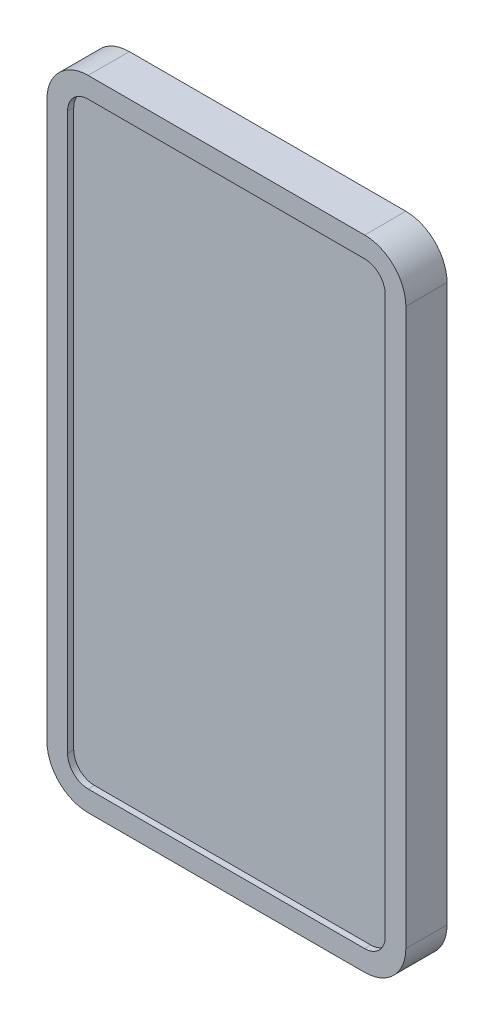
ISO-10303-21;
HEADER;
FILE_DESCRIPTION(('STEP AP214'),'2;1');
FILE_NAME('part.step','',(''),(''),'','','');
FILE_SCHEMA(('AUTOMOTIVE_DESIGN { 1 0 10303 214 1 1 1 1 }'));
ENDSEC;
DATA;
#1=APPLICATION_CONTEXT('core data for automotive mechanical design processes');
#2=APPLICATION_PROTOCOL_DEFINITION('international standard','automotive_design',2000,#1);
#3=PRODUCT_CONTEXT('',#1,'mechanical');
#4=PRODUCT('Part','Part','',(#3));
#5=PRODUCT_RELATED_PRODUCT_CATEGORY('part','',(#4));
#6=PRODUCT_DEFINITION_FORMATION('','',#4);
#7=PRODUCT_DEFINITION_CONTEXT('part definition',#1,'design');
#8=PRODUCT_DEFINITION('design','',#6,#7);
#9=PRODUCT_DEFINITION_SHAPE('','',#8);
#10=(LENGTH_UNIT() NAMED_UNIT(*) SI_UNIT(.MILLI.,.METRE.));
#11=(NAMED_UNIT(*) PLANE_ANGLE_UNIT() SI_UNIT($,.RADIAN.));
#12=(NAMED_UNIT(*) SI_UNIT($,.STERADIAN.) SOLID_ANGLE_UNIT());
#13=UNCERTAINTY_MEASURE_WITH_UNIT(LENGTH_MEASURE(1.E-05),#10,'distance_accuracy_value','');
#14=(GEOMETRIC_REPRESENTATION_CONTEXT(3) GLOBAL_UNCERTAINTY_ASSIGNED_CONTEXT((#13)) GLOBAL_UNIT_ASSIGNED_CONTEXT((#10,
#11,#12)) REPRESENTATION_CONTEXT('',''));
#15=CARTESIAN_POINT('',(0.,0.,0.));
#16=DIRECTION('',(0.,0.,1.));
#17=DIRECTION('',(1.,0.,0.));
#18=AXIS2_PLACEMENT_3D('',#15,#16,#17);
#19=CARTESIAN_POINT('',(0.,155.,20.));
#20=DIRECTION('',(0.,1.,0.));
#21=DIRECTION('',(0.,0.,1.));
#22=AXIS2_PLACEMENT_3D('',#19,#20,#21);
#23=PLANE('',#22);
#24=DIRECTION('',(1.,0.,0.));
#25=VECTOR('',#24,1.);
#26=CARTESIAN_POINT('',(0.,155.,0.));
#27=LINE('',#26,#25);
#28=CARTESIAN_POINT('',(-67.1082085684236,155.,0.));
#29=VERTEX_POINT('',#28);
#30=CARTESIAN_POINT('',(67.1082085684237,155.,0.));
#31=VERTEX_POINT('',#30);
#32=EDGE_CURVE('E139',#29,#31,#27,.T.);
#33=ORIENTED_EDGE('',*,*,#32,.F.);
#34=DIRECTION('',(0.,0.,-1.));
#35=VECTOR('',#34,1.);
#36=CARTESIAN_POINT('',(-67.1082085684236,155.,20.));
#37=LINE('',#36,#35);
#38=CARTESIAN_POINT('',(-67.1082085684236,155.,20.));
#39=VERTEX_POINT('',#38);
#40=EDGE_CURVE('E11',#39,#29,#37,.T.);
#41=ORIENTED_EDGE('',*,*,#40,.F.);
#42=DIRECTION('',(1.,0.,0.));
#43=VECTOR('',#42,1.);
#44=CARTESIAN_POINT('',(0.,155.,20.));
#45=LINE('',#44,#43);
#46=CARTESIAN_POINT('',(67.1082085684237,155.,20.));
#47=VERTEX_POINT('',#46);
#48=EDGE_CURVE('E158',#39,#47,#45,.T.);
#49=ORIENTED_EDGE('',*,*,#48,.T.);
#50=DIRECTION('',(0.,0.,-1.));
#51=VECTOR('',#50,1.);
#52=CARTESIAN_POINT('',(67.1082085684237,155.,20.));
#53=LINE('',#52,#51);
#54=EDGE_CURVE('E89',#47,#31,#53,.T.);
#55=ORIENTED_EDGE('',*,*,#54,.T.);
#56=EDGE_LOOP('',(#33,#41,#49,#55));
#57=FACE_BOUND('',#56,.T.);
#58=ADVANCED_FACE('F34',(#57),#23,.T.);
#59=CARTESIAN_POINT('',(-67.1082085684237,135.,20.));
#60=DIRECTION('',(0.,0.,-1.));
#61=DIRECTION('',(-1.,0.,0.));
#62=AXIS2_PLACEMENT_3D('',#59,#60,#61);
#63=CYLINDRICAL_SURFACE('',#62,20.);
#64=CARTESIAN_POINT('',(-67.1082085684237,135.,0.));
#65=DIRECTION('',(0.,0.,1.));
#66=DIRECTION('',(1.,0.,0.));
#67=AXIS2_PLACEMENT_3D('',#64,#65,#66);
#68=CIRCLE('',#67,20.);
#69=CARTESIAN_POINT('',(-87.1082085684237,135.,0.));
#70=VERTEX_POINT('',#69);
#71=EDGE_CURVE('E142',#29,#70,#68,.T.);
#72=ORIENTED_EDGE('',*,*,#71,.T.);
#73=DIRECTION('',(0.,0.,-1.));
#74=VECTOR('',#73,1.);
#75=CARTESIAN_POINT('',(-87.1082085684237,135.,20.));
#76=LINE('',#75,#74);
#77=CARTESIAN_POINT('',(-87.1082085684237,135.,20.));
#78=VERTEX_POINT('',#77);
#79=EDGE_CURVE('E41',#78,#70,#76,.T.);
#80=ORIENTED_EDGE('',*,*,#79,.F.);
#81=CARTESIAN_POINT('',(-67.1082085684237,135.,20.));
#82=DIRECTION('',(0.,0.,1.));
#83=DIRECTION('',(1.,0.,0.));
#84=AXIS2_PLACEMENT_3D('',#81,#82,#83);
#85=CIRCLE('',#84,20.);
#86=EDGE_CURVE('E190',#39,#78,#85,.T.);
#87=ORIENTED_EDGE('',*,*,#86,.F.);
#88=ORIENTED_EDGE('',*,*,#40,.T.);
#89=EDGE_LOOP('',(#72,#80,#87,#88));
#90=FACE_BOUND('',#89,.T.);
#91=ADVANCED_FACE('F175',(#90),#63,.T.);
#92=CARTESIAN_POINT('',(-87.1082085684237,0.,20.));
#93=DIRECTION('',(-1.,0.,0.));
#94=DIRECTION('',(0.,0.,1.));
#95=AXIS2_PLACEMENT_3D('',#92,#93,#94);
#96=PLANE('',#95);
#97=DIRECTION('',(0.,1.,0.));
#98=VECTOR('',#97,1.);
#99=CARTESIAN_POINT('',(-87.1082085684237,0.,0.));
#100=LINE('',#99,#98);
#101=CARTESIAN_POINT('',(-87.1082085684237,-135.,0.));
#102=VERTEX_POINT('',#101);
#103=EDGE_CURVE('E146',#102,#70,#100,.T.);
#104=ORIENTED_EDGE('',*,*,#103,.F.);
#105=DIRECTION('',(0.,0.,-1.));
#106=VECTOR('',#105,1.);
#107=CARTESIAN_POINT('',(-87.1082085684237,-135.,20.));
#108=LINE('',#107,#106);
#109=CARTESIAN_POINT('',(-87.1082085684237,-135.,20.));
#110=VERTEX_POINT('',#109);
#111=EDGE_CURVE('E165',#110,#102,#108,.T.);
#112=ORIENTED_EDGE('',*,*,#111,.F.);
#113=DIRECTION('',(0.,1.,0.));
#114=VECTOR('',#113,1.);
#115=CARTESIAN_POINT('',(-87.1082085684237,0.,20.));
#116=LINE('',#115,#114);
#117=EDGE_CURVE('E172',#110,#78,#116,.T.);
#118=ORIENTED_EDGE('',*,*,#117,.T.);
#119=ORIENTED_EDGE('',*,*,#79,.T.);
#120=EDGE_LOOP('',(#104,#112,#118,#119));
#121=FACE_BOUND('',#120,.T.);
#122=ADVANCED_FACE('F170',(#121),#96,.T.);
#123=CARTESIAN_POINT('',(-67.1082085684237,-135.,20.));
#124=DIRECTION('',(0.,0.,-1.));
#125=DIRECTION('',(-1.,0.,0.));
#126=AXIS2_PLACEMENT_3D('',#123,#124,#125);
#127=CYLINDRICAL_SURFACE('',#126,20.);
#128=CARTESIAN_POINT('',(-67.1082085684237,-135.,0.));
#129=DIRECTION('',(0.,0.,1.));
#130=DIRECTION('',(1.,0.,0.));
#131=AXIS2_PLACEMENT_3D('',#128,#129,#130);
#132=CIRCLE('',#131,20.);
#133=CARTESIAN_POINT('',(-67.1082085684236,-155.,0.));
#134=VERTEX_POINT('',#133);
#135=EDGE_CURVE('E149',#102,#134,#132,.T.);
#136=ORIENTED_EDGE('',*,*,#135,.T.);
#137=DIRECTION('',(0.,0.,-1.));
#138=VECTOR('',#137,1.);
#139=CARTESIAN_POINT('',(-67.1082085684236,-155.,20.));
#140=LINE('',#139,#138);
#141=CARTESIAN_POINT('',(-67.1082085684236,-155.,20.));
#142=VERTEX_POINT('',#141);
#143=EDGE_CURVE('E162',#142,#134,#140,.T.);
#144=ORIENTED_EDGE('',*,*,#143,.F.);
#145=CARTESIAN_POINT('',(-67.1082085684237,-135.,20.));
#146=DIRECTION('',(0.,0.,1.));
#147=DIRECTION('',(1.,0.,0.));
#148=AXIS2_PLACEMENT_3D('',#145,#146,#147);
#149=CIRCLE('',#148,20.);
#150=EDGE_CURVE('E186',#110,#142,#149,.T.);
#151=ORIENTED_EDGE('',*,*,#150,.F.);
#152=ORIENTED_EDGE('',*,*,#111,.T.);
#153=EDGE_LOOP('',(#136,#144,#151,#152));
#154=FACE_BOUND('',#153,.T.);
#155=ADVANCED_FACE('F182',(#154),#127,.T.);
#156=CARTESIAN_POINT('',(0.,-155.,20.));
#157=DIRECTION('',(0.,1.,0.));
#158=DIRECTION('',(-1.,0.,0.));
#159=AXIS2_PLACEMENT_3D('',#156,#157,#158);
#160=PLANE('',#159);
#161=DIRECTION('',(1.,0.,0.));
#162=VECTOR('',#161,1.);
#163=CARTESIAN_POINT('',(0.,-155.,0.));
#164=LINE('',#163,#162);
#165=CARTESIAN_POINT('',(67.1082085684237,-155.,0.));
#166=VERTEX_POINT('',#165);
#167=EDGE_CURVE('E151',#134,#166,#164,.T.);
#168=ORIENTED_EDGE('',*,*,#167,.T.);
#169=DIRECTION('',(0.,0.,-1.));
#170=VECTOR('',#169,1.);
#171=CARTESIAN_POINT('',(67.1082085684237,-155.,20.));
#172=LINE('',#171,#170);
#173=CARTESIAN_POINT('',(67.1082085684237,-155.,20.));
#174=VERTEX_POINT('',#173);
#175=EDGE_CURVE('E130',#174,#166,#172,.T.);
#176=ORIENTED_EDGE('',*,*,#175,.F.);
#177=DIRECTION('',(1.,0.,0.));
#178=VECTOR('',#177,1.);
#179=CARTESIAN_POINT('',(0.,-155.,20.));
#180=LINE('',#179,#178);
#181=EDGE_CURVE('E118',#142,#174,#180,.T.);
#182=ORIENTED_EDGE('',*,*,#181,.F.);
#183=ORIENTED_EDGE('',*,*,#143,.T.);
#184=EDGE_LOOP('',(#168,#176,#182,#183));
#185=FACE_BOUND('',#184,.T.);
#186=ADVANCED_FACE('F185',(#185),#160,.F.);
#187=CARTESIAN_POINT('',(67.1082085684238,-135.,20.));
#188=DIRECTION('',(0.,0.,-1.));
#189=DIRECTION('',(-1.,0.,0.));
#190=AXIS2_PLACEMENT_3D('',#187,#188,#189);
#191=CYLINDRICAL_SURFACE('',#190,20.);
#192=CARTESIAN_POINT('',(67.1082085684238,-135.,0.));
#193=DIRECTION('',(0.,0.,1.));
#194=DIRECTION('',(1.,0.,0.));
#195=AXIS2_PLACEMENT_3D('',#192,#193,#194);
#196=CIRCLE('',#195,20.);
#197=CARTESIAN_POINT('',(87.1082085684238,-135.,0.));
#198=VERTEX_POINT('',#197);
#199=EDGE_CURVE('E127',#166,#198,#196,.T.);
#200=ORIENTED_EDGE('',*,*,#199,.T.);
#201=DIRECTION('',(0.,0.,-1.));
#202=VECTOR('',#201,1.);
#203=CARTESIAN_POINT('',(87.1082085684238,-135.,20.));
#204=LINE('',#203,#202);
#205=CARTESIAN_POINT('',(87.1082085684238,-135.,20.));
#206=VERTEX_POINT('',#205);
#207=EDGE_CURVE('E124',#206,#198,#204,.T.);
#208=ORIENTED_EDGE('',*,*,#207,.F.);
#209=CARTESIAN_POINT('',(67.1082085684238,-135.,20.));
#210=DIRECTION('',(0.,0.,1.));
#211=DIRECTION('',(1.,0.,0.));
#212=AXIS2_PLACEMENT_3D('',#209,#210,#211);
#213=CIRCLE('',#212,20.);
#214=EDGE_CURVE('E111',#174,#206,#213,.T.);
#215=ORIENTED_EDGE('',*,*,#214,.F.);
#216=ORIENTED_EDGE('',*,*,#175,.T.);
#217=EDGE_LOOP('',(#200,#208,#215,#216));
#218=FACE_BOUND('',#217,.T.);
#219=ADVANCED_FACE('F125',(#218),#191,.T.);
#220=CARTESIAN_POINT('',(87.1082085684238,0.,20.));
#221=DIRECTION('',(-1.,0.,0.));
#222=DIRECTION('',(0.,0.,1.));
#223=AXIS2_PLACEMENT_3D('',#220,#221,#222);
#224=PLANE('',#223);
#225=DIRECTION('',(0.,1.,0.));
#226=VECTOR('',#225,1.);
#227=CARTESIAN_POINT('',(87.1082085684238,0.,0.));
#228=LINE('',#227,#226);
#229=CARTESIAN_POINT('',(87.1082085684238,135.,0.));
#230=VERTEX_POINT('',#229);
#231=EDGE_CURVE('E154',#198,#230,#228,.T.);
#232=ORIENTED_EDGE('',*,*,#231,.T.);
#233=DIRECTION('',(0.,0.,-1.));
#234=VECTOR('',#233,1.);
#235=CARTESIAN_POINT('',(87.1082085684238,135.,20.));
#236=LINE('',#235,#234);
#237=CARTESIAN_POINT('',(87.1082085684238,135.,20.));
#238=VERTEX_POINT('',#237);
#239=EDGE_CURVE('E131',#238,#230,#236,.T.);
#240=ORIENTED_EDGE('',*,*,#239,.F.);
#241=DIRECTION('',(0.,1.,0.));
#242=VECTOR('',#241,1.);
#243=CARTESIAN_POINT('',(87.1082085684238,0.,20.));
#244=LINE('',#243,#242);
#245=EDGE_CURVE('E115',#206,#238,#244,.T.);
#246=ORIENTED_EDGE('',*,*,#245,.F.);
#247=ORIENTED_EDGE('',*,*,#207,.T.);
#248=EDGE_LOOP('',(#232,#240,#246,#247));
#249=FACE_BOUND('',#248,.T.);
#250=ADVANCED_FACE('F133',(#249),#224,.F.);
#251=CARTESIAN_POINT('',(67.1082085684238,135.,20.));
#252=DIRECTION('',(0.,0.,-1.));
#253=DIRECTION('',(-1.,0.,0.));
#254=AXIS2_PLACEMENT_3D('',#251,#252,#253);
#255=CYLINDRICAL_SURFACE('',#254,20.);
#256=CARTESIAN_POINT('',(67.1082085684238,135.,0.));
#257=DIRECTION('',(0.,0.,1.));
#258=DIRECTION('',(1.,0.,0.));
#259=AXIS2_PLACEMENT_3D('',#256,#257,#258);
#260=CIRCLE('',#259,20.);
#261=EDGE_CURVE('E156',#230,#31,#260,.T.);
#262=ORIENTED_EDGE('',*,*,#261,.T.);
#263=ORIENTED_EDGE('',*,*,#54,.F.);
#264=CARTESIAN_POINT('',(67.1082085684238,135.,20.));
#265=DIRECTION('',(0.,0.,1.));
#266=DIRECTION('',(1.,0.,0.));
#267=AXIS2_PLACEMENT_3D('',#264,#265,#266);
#268=CIRCLE('',#267,20.);
#269=EDGE_CURVE('E57',#238,#47,#268,.T.);
#270=ORIENTED_EDGE('',*,*,#269,.F.);
#271=ORIENTED_EDGE('',*,*,#239,.T.);
#272=EDGE_LOOP('',(#262,#263,#270,#271));
#273=FACE_BOUND('',#272,.T.);
#274=ADVANCED_FACE('F339',(#273),#255,.T.);
#275=CARTESIAN_POINT('',(0.,0.,20.));
#276=DIRECTION('',(0.,0.,1.));
#277=DIRECTION('',(1.,0.,0.));
#278=AXIS2_PLACEMENT_3D('',#275,#276,#277);
#279=PLANE('',#278);
#280=CARTESIAN_POINT('',(67.1082085684238,135.,20.));
#281=DIRECTION('',(0.,0.,1.));
#282=DIRECTION('',(1.,0.,0.));
#283=AXIS2_PLACEMENT_3D('',#280,#281,#282);
#284=CIRCLE('',#283,9.99999999999999);
#285=CARTESIAN_POINT('',(77.1082085684238,135.,20.));
#286=VERTEX_POINT('',#285);
#287=CARTESIAN_POINT('',(67.1082085684237,145.,20.));
#288=VERTEX_POINT('',#287);
#289=EDGE_CURVE('E48',#286,#288,#284,.T.);
#290=ORIENTED_EDGE('',*,*,#289,.F.);
#291=DIRECTION('',(0.,1.,0.));
#292=VECTOR('',#291,1.);
#293=CARTESIAN_POINT('',(77.1082085684238,-135.,20.));
#294=LINE('',#293,#292);
#295=CARTESIAN_POINT('',(77.1082085684238,-135.,20.));
#296=VERTEX_POINT('',#295);
#297=EDGE_CURVE('E215',#296,#286,#294,.T.);
#298=ORIENTED_EDGE('',*,*,#297,.F.);
#299=CARTESIAN_POINT('',(67.1082085684238,-135.,20.));
#300=DIRECTION('',(0.,0.,1.));
#301=DIRECTION('',(1.,0.,0.));
#302=AXIS2_PLACEMENT_3D('',#299,#300,#301);
#303=CIRCLE('',#302,9.99999999999999);
#304=CARTESIAN_POINT('',(67.1082085684237,-145.,20.));
#305=VERTEX_POINT('',#304);
#306=EDGE_CURVE('E219',#305,#296,#303,.T.);
#307=ORIENTED_EDGE('',*,*,#306,.F.);
#308=DIRECTION('',(1.,0.,0.));
#309=VECTOR('',#308,1.);
#310=CARTESIAN_POINT('',(-67.1082085684236,-145.,20.));
#311=LINE('',#310,#309);
#312=CARTESIAN_POINT('',(-67.1082085684236,-145.,20.));
#313=VERTEX_POINT('',#312);
#314=EDGE_CURVE('E222',#313,#305,#311,.T.);
#315=ORIENTED_EDGE('',*,*,#314,.F.);
#316=CARTESIAN_POINT('',(-67.1082085684237,-135.,20.));
#317=DIRECTION('',(0.,0.,1.));
#318=DIRECTION('',(1.,0.,0.));
#319=AXIS2_PLACEMENT_3D('',#316,#317,#318);
#320=CIRCLE('',#319,10.);
#321=CARTESIAN_POINT('',(-77.1082085684237,-135.,20.));
#322=VERTEX_POINT('',#321);
#323=EDGE_CURVE('E225',#322,#313,#320,.T.);
#324=ORIENTED_EDGE('',*,*,#323,.F.);
#325=DIRECTION('',(0.,-1.,0.));
#326=VECTOR('',#325,1.);
#327=CARTESIAN_POINT('',(-77.1082085684237,135.,20.));
#328=LINE('',#327,#326);
#329=CARTESIAN_POINT('',(-77.1082085684237,135.,20.));
#330=VERTEX_POINT('',#329);
#331=EDGE_CURVE('E228',#330,#322,#328,.T.);
#332=ORIENTED_EDGE('',*,*,#331,.F.);
#333=CARTESIAN_POINT('',(-67.1082085684237,135.,20.));
#334=DIRECTION('',(0.,0.,1.));
#335=DIRECTION('',(1.,0.,0.));
#336=AXIS2_PLACEMENT_3D('',#333,#334,#335);
#337=CIRCLE('',#336,9.99999999999999);
#338=CARTESIAN_POINT('',(-67.1082085684236,145.,20.));
#339=VERTEX_POINT('',#338);
#340=EDGE_CURVE('E231',#339,#330,#337,.T.);
#341=ORIENTED_EDGE('',*,*,#340,.F.);
#342=DIRECTION('',(-1.,0.,0.));
#343=VECTOR('',#342,1.);
#344=CARTESIAN_POINT('',(67.1082085684237,145.,20.));
#345=LINE('',#344,#343);
#346=EDGE_CURVE('E234',#288,#339,#345,.T.);
#347=ORIENTED_EDGE('',*,*,#346,.F.);
#348=EDGE_LOOP('',(#290,#298,#307,#315,#324,#332,#341,#347));
#349=FACE_BOUND('',#348,.T.);
#350=ORIENTED_EDGE('',*,*,#48,.F.);
#351=ORIENTED_EDGE('',*,*,#86,.T.);
#352=ORIENTED_EDGE('',*,*,#117,.F.);
#353=ORIENTED_EDGE('',*,*,#150,.T.);
#354=ORIENTED_EDGE('',*,*,#181,.T.);
#355=ORIENTED_EDGE('',*,*,#214,.T.);
#356=ORIENTED_EDGE('',*,*,#245,.T.);
#357=ORIENTED_EDGE('',*,*,#269,.T.);
#358=EDGE_LOOP('',(#350,#351,#352,#353,#354,#355,#356,#357));
#359=FACE_BOUND('',#358,.T.);
#360=ADVANCED_FACE('F113',(#349,#359),#279,.T.);
#361=CARTESIAN_POINT('',(0.,0.,0.));
#362=DIRECTION('',(0.,0.,1.));
#363=DIRECTION('',(1.,0.,0.));
#364=AXIS2_PLACEMENT_3D('',#361,#362,#363);
#365=PLANE('',#364);
#366=ORIENTED_EDGE('',*,*,#32,.T.);
#367=ORIENTED_EDGE('',*,*,#261,.F.);
#368=ORIENTED_EDGE('',*,*,#231,.F.);
#369=ORIENTED_EDGE('',*,*,#199,.F.);
#370=ORIENTED_EDGE('',*,*,#167,.F.);
#371=ORIENTED_EDGE('',*,*,#135,.F.);
#372=ORIENTED_EDGE('',*,*,#103,.T.);
#373=ORIENTED_EDGE('',*,*,#71,.F.);
#374=EDGE_LOOP('',(#366,#367,#368,#369,#370,#371,#372,#373));
#375=FACE_BOUND('',#374,.T.);
#376=ADVANCED_FACE('F178',(#375),#365,.F.);
#377=CARTESIAN_POINT('',(67.1082085684238,135.,17.));
#378=DIRECTION('',(0.,0.,1.));
#379=DIRECTION('',(1.,0.,0.));
#380=AXIS2_PLACEMENT_3D('',#377,#378,#379);
#381=CYLINDRICAL_SURFACE('',#380,9.99999999999999);
#382=ORIENTED_EDGE('',*,*,#289,.T.);
#383=DIRECTION('',(0.,0.,1.));
#384=VECTOR('',#383,1.);
#385=CARTESIAN_POINT('',(67.1082085684237,145.,17.));
#386=LINE('',#385,#384);
#387=CARTESIAN_POINT('',(67.1082085684237,145.,17.));
#388=VERTEX_POINT('',#387);
#389=EDGE_CURVE('E193',#388,#288,#386,.T.);
#390=ORIENTED_EDGE('',*,*,#389,.F.);
#391=CARTESIAN_POINT('',(67.1082085684238,135.,17.));
#392=DIRECTION('',(0.,0.,1.));
#393=DIRECTION('',(1.,0.,0.));
#394=AXIS2_PLACEMENT_3D('',#391,#392,#393);
#395=CIRCLE('',#394,9.99999999999999);
#396=CARTESIAN_POINT('',(77.1082085684238,135.,17.));
#397=VERTEX_POINT('',#396);
#398=EDGE_CURVE('E218',#397,#388,#395,.T.);
#399=ORIENTED_EDGE('',*,*,#398,.F.);
#400=DIRECTION('',(0.,0.,1.));
#401=VECTOR('',#400,1.);
#402=CARTESIAN_POINT('',(77.1082085684238,135.,17.));
#403=LINE('',#402,#401);
#404=EDGE_CURVE('E143',#397,#286,#403,.T.);
#405=ORIENTED_EDGE('',*,*,#404,.T.);
#406=EDGE_LOOP('',(#382,#390,#399,#405));
#407=FACE_BOUND('',#406,.T.);
#408=ADVANCED_FACE('F267',(#407),#381,.F.);
#409=CARTESIAN_POINT('',(77.1082085684238,-135.,17.));
#410=DIRECTION('',(1.,0.,0.));
#411=DIRECTION('',(0.,1.,0.));
#412=AXIS2_PLACEMENT_3D('',#409,#410,#411);
#413=PLANE('',#412);
#414=ORIENTED_EDGE('',*,*,#297,.T.);
#415=ORIENTED_EDGE('',*,*,#404,.F.);
#416=DIRECTION('',(0.,1.,0.));
#417=VECTOR('',#416,1.);
#418=CARTESIAN_POINT('',(77.1082085684238,-135.,17.));
#419=LINE('',#418,#417);
#420=CARTESIAN_POINT('',(77.1082085684238,-135.,17.));
#421=VERTEX_POINT('',#420);
#422=EDGE_CURVE('E196',#421,#397,#419,.T.);
#423=ORIENTED_EDGE('',*,*,#422,.F.);
#424=DIRECTION('',(0.,0.,1.));
#425=VECTOR('',#424,1.);
#426=CARTESIAN_POINT('',(77.1082085684238,-135.,17.));
#427=LINE('',#426,#425);
#428=EDGE_CURVE('E211',#421,#296,#427,.T.);
#429=ORIENTED_EDGE('',*,*,#428,.T.);
#430=EDGE_LOOP('',(#414,#415,#423,#429));
#431=FACE_BOUND('',#430,.T.);
#432=ADVANCED_FACE('F287',(#431),#413,.F.);
#433=CARTESIAN_POINT('',(67.1082085684238,-135.,17.));
#434=DIRECTION('',(0.,0.,1.));
#435=DIRECTION('',(1.,0.,0.));
#436=AXIS2_PLACEMENT_3D('',#433,#434,#435);
#437=CYLINDRICAL_SURFACE('',#436,9.99999999999999);
#438=ORIENTED_EDGE('',*,*,#306,.T.);
#439=ORIENTED_EDGE('',*,*,#428,.F.);
#440=CARTESIAN_POINT('',(67.1082085684238,-135.,17.));
#441=DIRECTION('',(0.,0.,1.));
#442=DIRECTION('',(1.,0.,0.));
#443=AXIS2_PLACEMENT_3D('',#440,#441,#442);
#444=CIRCLE('',#443,9.99999999999999);
#445=CARTESIAN_POINT('',(67.1082085684237,-145.,17.));
#446=VERTEX_POINT('',#445);
#447=EDGE_CURVE('E240',#446,#421,#444,.T.);
#448=ORIENTED_EDGE('',*,*,#447,.F.);
#449=DIRECTION('',(0.,0.,1.));
#450=VECTOR('',#449,1.);
#451=CARTESIAN_POINT('',(67.1082085684237,-145.,17.));
#452=LINE('',#451,#450);
#453=EDGE_CURVE('E208',#446,#305,#452,.T.);
#454=ORIENTED_EDGE('',*,*,#453,.T.);
#455=EDGE_LOOP('',(#438,#439,#448,#454));
#456=FACE_BOUND('',#455,.T.);
#457=ADVANCED_FACE('F292',(#456),#437,.F.);
#458=CARTESIAN_POINT('',(-67.1082085684236,-145.,17.));
#459=DIRECTION('',(0.,-1.,0.));
#460=DIRECTION('',(1.,0.,0.));
#461=AXIS2_PLACEMENT_3D('',#458,#459,#460);
#462=PLANE('',#461);
#463=ORIENTED_EDGE('',*,*,#314,.T.);
#464=ORIENTED_EDGE('',*,*,#453,.F.);
#465=DIRECTION('',(1.,0.,0.));
#466=VECTOR('',#465,1.);
#467=CARTESIAN_POINT('',(-67.1082085684236,-145.,17.));
#468=LINE('',#467,#466);
#469=CARTESIAN_POINT('',(-67.1082085684236,-145.,17.));
#470=VERTEX_POINT('',#469);
#471=EDGE_CURVE('E243',#470,#446,#468,.T.);
#472=ORIENTED_EDGE('',*,*,#471,.F.);
#473=DIRECTION('',(0.,0.,1.));
#474=VECTOR('',#473,1.);
#475=CARTESIAN_POINT('',(-67.1082085684236,-145.,17.));
#476=LINE('',#475,#474);
#477=EDGE_CURVE('E205',#470,#313,#476,.T.);
#478=ORIENTED_EDGE('',*,*,#477,.T.);
#479=EDGE_LOOP('',(#463,#464,#472,#478));
#480=FACE_BOUND('',#479,.T.);
#481=ADVANCED_FACE('F318',(#480),#462,.F.);
#482=CARTESIAN_POINT('',(-67.1082085684237,-135.,17.));
#483=DIRECTION('',(0.,0.,1.));
#484=DIRECTION('',(1.,0.,0.));
#485=AXIS2_PLACEMENT_3D('',#482,#483,#484);
#486=CYLINDRICAL_SURFACE('',#485,10.);
#487=ORIENTED_EDGE('',*,*,#323,.T.);
#488=ORIENTED_EDGE('',*,*,#477,.F.);
#489=CARTESIAN_POINT('',(-67.1082085684237,-135.,17.));
#490=DIRECTION('',(0.,0.,1.));
#491=DIRECTION('',(1.,0.,0.));
#492=AXIS2_PLACEMENT_3D('',#489,#490,#491);
#493=CIRCLE('',#492,10.);
#494=CARTESIAN_POINT('',(-77.1082085684237,-135.,17.));
#495=VERTEX_POINT('',#494);
#496=EDGE_CURVE('E246',#495,#470,#493,.T.);
#497=ORIENTED_EDGE('',*,*,#496,.F.);
#498=DIRECTION('',(0.,0.,1.));
#499=VECTOR('',#498,1.);
#500=CARTESIAN_POINT('',(-77.1082085684237,-135.,17.));
#501=LINE('',#500,#499);
#502=EDGE_CURVE('E202',#495,#322,#501,.T.);
#503=ORIENTED_EDGE('',*,*,#502,.T.);
#504=EDGE_LOOP('',(#487,#488,#497,#503));
#505=FACE_BOUND('',#504,.T.);
#506=ADVANCED_FACE('F321',(#505),#486,.F.);
#507=CARTESIAN_POINT('',(-77.1082085684237,135.,17.));
#508=DIRECTION('',(-1.,0.,0.));
#509=DIRECTION('',(0.,-1.,0.));
#510=AXIS2_PLACEMENT_3D('',#507,#508,#509);
#511=PLANE('',#510);
#512=ORIENTED_EDGE('',*,*,#331,.T.);
#513=ORIENTED_EDGE('',*,*,#502,.F.);
#514=DIRECTION('',(0.,-1.,0.));
#515=VECTOR('',#514,1.);
#516=CARTESIAN_POINT('',(-77.1082085684237,135.,17.));
#517=LINE('',#516,#515);
#518=CARTESIAN_POINT('',(-77.1082085684237,135.,17.));
#519=VERTEX_POINT('',#518);
#520=EDGE_CURVE('E249',#519,#495,#517,.T.);
#521=ORIENTED_EDGE('',*,*,#520,.F.);
#522=DIRECTION('',(0.,0.,1.));
#523=VECTOR('',#522,1.);
#524=CARTESIAN_POINT('',(-77.1082085684237,135.,17.));
#525=LINE('',#524,#523);
#526=EDGE_CURVE('E199',#519,#330,#525,.T.);
#527=ORIENTED_EDGE('',*,*,#526,.T.);
#528=EDGE_LOOP('',(#512,#513,#521,#527));
#529=FACE_BOUND('',#528,.T.);
#530=ADVANCED_FACE('F324',(#529),#511,.F.);
#531=CARTESIAN_POINT('',(-67.1082085684237,135.,17.));
#532=DIRECTION('',(0.,0.,1.));
#533=DIRECTION('',(1.,0.,0.));
#534=AXIS2_PLACEMENT_3D('',#531,#532,#533);
#535=CYLINDRICAL_SURFACE('',#534,9.99999999999999);
#536=ORIENTED_EDGE('',*,*,#340,.T.);
#537=ORIENTED_EDGE('',*,*,#526,.F.);
#538=CARTESIAN_POINT('',(-67.1082085684237,135.,17.));
#539=DIRECTION('',(0.,0.,1.));
#540=DIRECTION('',(1.,0.,0.));
#541=AXIS2_PLACEMENT_3D('',#538,#539,#540);
#542=CIRCLE('',#541,9.99999999999999);
#543=CARTESIAN_POINT('',(-67.1082085684236,145.,17.));
#544=VERTEX_POINT('',#543);
#545=EDGE_CURVE('E252',#544,#519,#542,.T.);
#546=ORIENTED_EDGE('',*,*,#545,.F.);
#547=DIRECTION('',(0.,0.,1.));
#548=VECTOR('',#547,1.);
#549=CARTESIAN_POINT('',(-67.1082085684236,145.,17.));
#550=LINE('',#549,#548);
#551=EDGE_CURVE('E195',#544,#339,#550,.T.);
#552=ORIENTED_EDGE('',*,*,#551,.T.);
#553=EDGE_LOOP('',(#536,#537,#546,#552));
#554=FACE_BOUND('',#553,.T.);
#555=ADVANCED_FACE('F307',(#554),#535,.F.);
#556=CARTESIAN_POINT('',(67.1082085684237,145.,17.));
#557=DIRECTION('',(0.,1.,0.));
#558=DIRECTION('',(0.,0.,1.));
#559=AXIS2_PLACEMENT_3D('',#556,#557,#558);
#560=PLANE('',#559);
#561=ORIENTED_EDGE('',*,*,#346,.T.);
#562=ORIENTED_EDGE('',*,*,#551,.F.);
#563=DIRECTION('',(-1.,0.,0.));
#564=VECTOR('',#563,1.);
#565=CARTESIAN_POINT('',(67.1082085684237,145.,17.));
#566=LINE('',#565,#564);
#567=EDGE_CURVE('E255',#388,#544,#566,.T.);
#568=ORIENTED_EDGE('',*,*,#567,.F.);
#569=ORIENTED_EDGE('',*,*,#389,.T.);
#570=EDGE_LOOP('',(#561,#562,#568,#569));
#571=FACE_BOUND('',#570,.T.);
#572=ADVANCED_FACE('F301',(#571),#560,.F.);
#573=CARTESIAN_POINT('',(67.1082085684238,135.,17.));
#574=DIRECTION('',(0.,0.,1.));
#575=DIRECTION('',(1.,0.,0.));
#576=AXIS2_PLACEMENT_3D('',#573,#574,#575);
#577=PLANE('',#576);
#578=ORIENTED_EDGE('',*,*,#398,.T.);
#579=ORIENTED_EDGE('',*,*,#567,.T.);
#580=ORIENTED_EDGE('',*,*,#545,.T.);
#581=ORIENTED_EDGE('',*,*,#520,.T.);
#582=ORIENTED_EDGE('',*,*,#496,.T.);
#583=ORIENTED_EDGE('',*,*,#471,.T.);
#584=ORIENTED_EDGE('',*,*,#447,.T.);
#585=ORIENTED_EDGE('',*,*,#422,.T.);
#586=EDGE_LOOP('',(#578,#579,#580,#581,#582,#583,#584,#585));
#587=FACE_BOUND('',#586,.T.);
#588=ADVANCED_FACE('F262',(#587),#577,.T.);
#589=CLOSED_SHELL('',(#58,#91,#122,#155,#186,#219,#250,#274,#360,#376,#408,#432,#457,#481,#506,
#530,#555,#572,#588));
#590=MANIFOLD_SOLID_BREP('B2',#589);
#591=ADVANCED_BREP_SHAPE_REPRESENTATION('',(#18,#590),#14);
#592=SHAPE_DEFINITION_REPRESENTATION(#9,#591);
ENDSEC;
END-ISO-10303-21;
